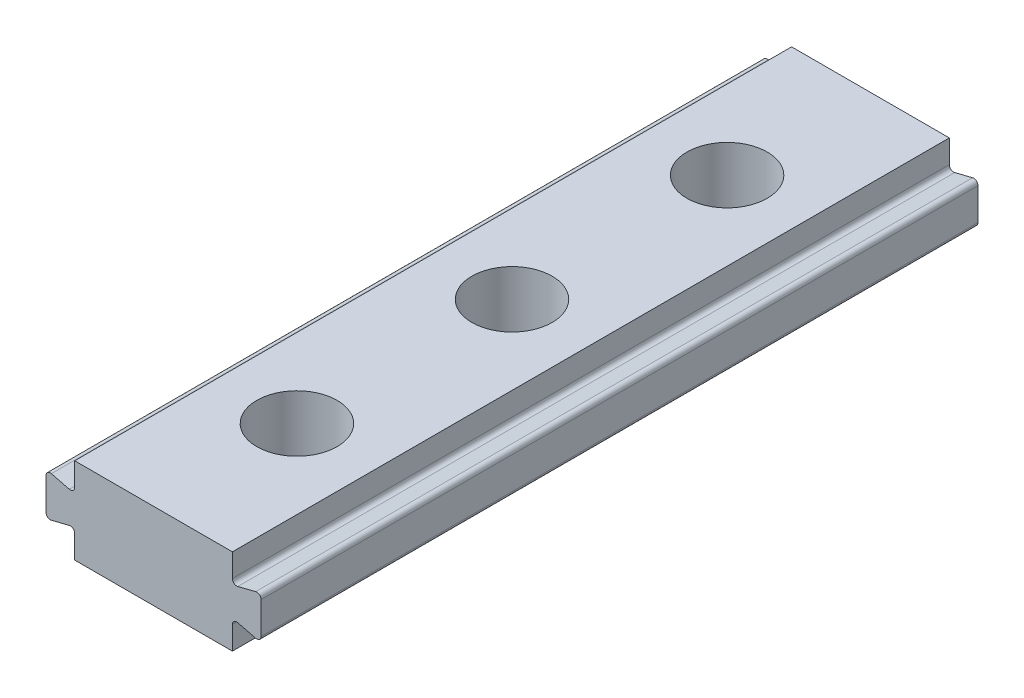
ISO-10303-21;
HEADER;
FILE_DESCRIPTION(('STEP AP214'),'2;1');
FILE_NAME('part.step','',(''),(''),'','','');
FILE_SCHEMA(('AUTOMOTIVE_DESIGN { 1 0 10303 214 1 1 1 1 }'));
ENDSEC;
DATA;
#1=APPLICATION_CONTEXT('core data for automotive mechanical design processes');
#2=APPLICATION_PROTOCOL_DEFINITION('international standard','automotive_design',2000,#1);
#3=PRODUCT_CONTEXT('',#1,'mechanical');
#4=PRODUCT('Part','Part','',(#3));
#5=PRODUCT_RELATED_PRODUCT_CATEGORY('part','',(#4));
#6=PRODUCT_DEFINITION_FORMATION('','',#4);
#7=PRODUCT_DEFINITION_CONTEXT('part definition',#1,'design');
#8=PRODUCT_DEFINITION('design','',#6,#7);
#9=PRODUCT_DEFINITION_SHAPE('','',#8);
#10=(LENGTH_UNIT() NAMED_UNIT(*) SI_UNIT(.MILLI.,.METRE.));
#11=(NAMED_UNIT(*) PLANE_ANGLE_UNIT() SI_UNIT($,.RADIAN.));
#12=(NAMED_UNIT(*) SI_UNIT($,.STERADIAN.) SOLID_ANGLE_UNIT());
#13=UNCERTAINTY_MEASURE_WITH_UNIT(LENGTH_MEASURE(1.E-05),#10,'distance_accuracy_value','');
#14=(GEOMETRIC_REPRESENTATION_CONTEXT(3) GLOBAL_UNCERTAINTY_ASSIGNED_CONTEXT((#13)) GLOBAL_UNIT_ASSIGNED_CONTEXT((#10,
#11,#12)) REPRESENTATION_CONTEXT('',''));
#15=CARTESIAN_POINT('',(0.,0.,0.));
#16=DIRECTION('',(0.,0.,1.));
#17=DIRECTION('',(1.,0.,0.));
#18=AXIS2_PLACEMENT_3D('',#15,#16,#17);
#19=CARTESIAN_POINT('',(-7.5,-3.,25.));
#20=DIRECTION('',(-1.,0.,0.));
#21=DIRECTION('',(0.,0.,1.));
#22=AXIS2_PLACEMENT_3D('',#19,#20,#21);
#23=PLANE('',#22);
#24=DIRECTION('',(0.,0.,1.));
#25=VECTOR('',#24,1.);
#26=CARTESIAN_POINT('',(-7.5,-1.11576707807868,-25.));
#27=LINE('',#26,#25);
#28=CARTESIAN_POINT('',(-7.5,-1.11576707807868,25.));
#29=VERTEX_POINT('',#28);
#30=CARTESIAN_POINT('',(-7.5,-1.11576707807868,-25.));
#31=VERTEX_POINT('',#30);
#32=EDGE_CURVE('E206',#29,#31,#27,.F.);
#33=ORIENTED_EDGE('',*,*,#32,.F.);
#34=DIRECTION('',(0.,1.,0.));
#35=VECTOR('',#34,1.);
#36=CARTESIAN_POINT('',(-7.5,-3.,25.));
#37=LINE('',#36,#35);
#38=CARTESIAN_POINT('',(-7.5,1.11576707807868,25.));
#39=VERTEX_POINT('',#38);
#40=EDGE_CURVE('E306',#29,#39,#37,.T.);
#41=ORIENTED_EDGE('',*,*,#40,.T.);
#42=DIRECTION('',(0.,0.,1.));
#43=VECTOR('',#42,1.);
#44=CARTESIAN_POINT('',(-7.5,1.11576707807868,-25.));
#45=LINE('',#44,#43);
#46=CARTESIAN_POINT('',(-7.5,1.11576707807868,-25.));
#47=VERTEX_POINT('',#46);
#48=EDGE_CURVE('E238',#39,#47,#45,.F.);
#49=ORIENTED_EDGE('',*,*,#48,.T.);
#50=DIRECTION('',(0.,1.,0.));
#51=VECTOR('',#50,1.);
#52=CARTESIAN_POINT('',(-7.5,-3.,-25.));
#53=LINE('',#52,#51);
#54=EDGE_CURVE('E309',#31,#47,#53,.T.);
#55=ORIENTED_EDGE('',*,*,#54,.F.);
#56=EDGE_LOOP('',(#33,#41,#49,#55));
#57=FACE_BOUND('',#56,.T.);
#58=ADVANCED_FACE('F34',(#57),#23,.T.);
#59=CARTESIAN_POINT('',(7.5,-3.,25.));
#60=DIRECTION('',(1.,0.,0.));
#61=DIRECTION('',(0.,0.,-1.));
#62=AXIS2_PLACEMENT_3D('',#59,#60,#61);
#63=PLANE('',#62);
#64=DIRECTION('',(0.,1.,0.));
#65=VECTOR('',#64,1.);
#66=CARTESIAN_POINT('',(7.5,-3.,-25.));
#67=LINE('',#66,#65);
#68=CARTESIAN_POINT('',(7.5,-1.11576707807868,-25.));
#69=VERTEX_POINT('',#68);
#70=CARTESIAN_POINT('',(7.5,1.11576707807868,-25.));
#71=VERTEX_POINT('',#70);
#72=EDGE_CURVE('E301',#69,#71,#67,.T.);
#73=ORIENTED_EDGE('',*,*,#72,.T.);
#74=DIRECTION('',(0.,0.,1.));
#75=VECTOR('',#74,1.);
#76=CARTESIAN_POINT('',(7.5,1.11576707807868,25.));
#77=LINE('',#76,#75);
#78=CARTESIAN_POINT('',(7.5,1.11576707807868,25.));
#79=VERTEX_POINT('',#78);
#80=EDGE_CURVE('E331',#71,#79,#77,.T.);
#81=ORIENTED_EDGE('',*,*,#80,.T.);
#82=DIRECTION('',(0.,1.,0.));
#83=VECTOR('',#82,1.);
#84=CARTESIAN_POINT('',(7.5,-3.,25.));
#85=LINE('',#84,#83);
#86=CARTESIAN_POINT('',(7.5,-1.11576707807868,25.));
#87=VERTEX_POINT('',#86);
#88=EDGE_CURVE('E302',#87,#79,#85,.T.);
#89=ORIENTED_EDGE('',*,*,#88,.F.);
#90=DIRECTION('',(0.,0.,1.));
#91=VECTOR('',#90,1.);
#92=CARTESIAN_POINT('',(7.5,-1.11576707807868,-25.));
#93=LINE('',#92,#91);
#94=EDGE_CURVE('E320',#87,#69,#93,.F.);
#95=ORIENTED_EDGE('',*,*,#94,.T.);
#96=EDGE_LOOP('',(#73,#81,#89,#95));
#97=FACE_BOUND('',#96,.T.);
#98=ADVANCED_FACE('F369',(#97),#63,.T.);
#99=CARTESIAN_POINT('',(-7.5,-3.,25.));
#100=DIRECTION('',(0.,0.,1.));
#101=DIRECTION('',(1.,0.,0.));
#102=AXIS2_PLACEMENT_3D('',#99,#100,#101);
#103=PLANE('',#102);
#104=DIRECTION('',(0.,-1.,0.));
#105=VECTOR('',#104,1.);
#106=CARTESIAN_POINT('',(-5.5,-3.,25.));
#107=LINE('',#106,#105);
#108=CARTESIAN_POINT('',(-5.5,-1.38423292192132,25.));
#109=VERTEX_POINT('',#108);
#110=CARTESIAN_POINT('',(-5.5,-3.,25.));
#111=VERTEX_POINT('',#110);
#112=EDGE_CURVE('E211',#109,#111,#107,.T.);
#113=ORIENTED_EDGE('',*,*,#112,.T.);
#114=DIRECTION('',(1.,0.,0.));
#115=VECTOR('',#114,1.);
#116=CARTESIAN_POINT('',(-7.5,-3.,25.));
#117=LINE('',#116,#115);
#118=CARTESIAN_POINT('',(5.5,-3.,25.));
#119=VERTEX_POINT('',#118);
#120=EDGE_CURVE('E299',#111,#119,#117,.T.);
#121=ORIENTED_EDGE('',*,*,#120,.T.);
#122=DIRECTION('',(0.,-1.,0.));
#123=VECTOR('',#122,1.);
#124=CARTESIAN_POINT('',(5.5,-3.,25.));
#125=LINE('',#124,#123);
#126=CARTESIAN_POINT('',(5.5,-1.38423292192132,25.));
#127=VERTEX_POINT('',#126);
#128=EDGE_CURVE('E263',#127,#119,#125,.T.);
#129=ORIENTED_EDGE('',*,*,#128,.F.);
#130=CARTESIAN_POINT('',(5.8,-1.38423292192132,25.));
#131=DIRECTION('',(0.,0.,1.));
#132=DIRECTION('',(1.,0.,0.));
#133=AXIS2_PLACEMENT_3D('',#130,#131,#132);
#134=CIRCLE('',#133,0.3);
#135=CARTESIAN_POINT('',(5.8727606875109,-1.09319017187772,25.));
#136=VERTEX_POINT('',#135);
#137=EDGE_CURVE('E327',#127,#136,#134,.F.);
#138=ORIENTED_EDGE('',*,*,#137,.T.);
#139=DIRECTION('',(-0.970142500145332,0.242535625036333,0.));
#140=VECTOR('',#139,1.);
#141=CARTESIAN_POINT('',(5.5,-1.,25.));
#142=LINE('',#141,#140);
#143=CARTESIAN_POINT('',(7.1272393124891,-1.40680982812228,25.));
#144=VERTEX_POINT('',#143);
#145=EDGE_CURVE('E260',#144,#136,#142,.T.);
#146=ORIENTED_EDGE('',*,*,#145,.F.);
#147=CARTESIAN_POINT('',(7.2,-1.11576707807868,25.));
#148=DIRECTION('',(0.,0.,1.));
#149=DIRECTION('',(1.,0.,0.));
#150=AXIS2_PLACEMENT_3D('',#147,#148,#149);
#151=CIRCLE('',#150,0.3);
#152=EDGE_CURVE('E318',#144,#87,#151,.T.);
#153=ORIENTED_EDGE('',*,*,#152,.T.);
#154=ORIENTED_EDGE('',*,*,#88,.T.);
#155=CARTESIAN_POINT('',(7.2,1.11576707807868,25.));
#156=DIRECTION('',(0.,0.,1.));
#157=DIRECTION('',(1.,0.,0.));
#158=AXIS2_PLACEMENT_3D('',#155,#156,#157);
#159=CIRCLE('',#158,0.3);
#160=CARTESIAN_POINT('',(7.1272393124891,1.40680982812228,25.));
#161=VERTEX_POINT('',#160);
#162=EDGE_CURVE('E334',#79,#161,#159,.T.);
#163=ORIENTED_EDGE('',*,*,#162,.T.);
#164=DIRECTION('',(-0.970142500145332,-0.242535625036333,0.));
#165=VECTOR('',#164,1.);
#166=CARTESIAN_POINT('',(5.5,1.,25.));
#167=LINE('',#166,#165);
#168=CARTESIAN_POINT('',(5.8727606875109,1.09319017187772,25.));
#169=VERTEX_POINT('',#168);
#170=EDGE_CURVE('E249',#161,#169,#167,.T.);
#171=ORIENTED_EDGE('',*,*,#170,.T.);
#172=CARTESIAN_POINT('',(5.8,1.38423292192132,25.));
#173=DIRECTION('',(0.,0.,1.));
#174=DIRECTION('',(1.,0.,0.));
#175=AXIS2_PLACEMENT_3D('',#172,#173,#174);
#176=CIRCLE('',#175,0.3);
#177=CARTESIAN_POINT('',(5.5,1.38423292192132,25.));
#178=VERTEX_POINT('',#177);
#179=EDGE_CURVE('E42',#169,#178,#176,.F.);
#180=ORIENTED_EDGE('',*,*,#179,.T.);
#181=DIRECTION('',(0.,1.,0.));
#182=VECTOR('',#181,1.);
#183=CARTESIAN_POINT('',(5.5,3.,25.));
#184=LINE('',#183,#182);
#185=CARTESIAN_POINT('',(5.5,3.,25.));
#186=VERTEX_POINT('',#185);
#187=EDGE_CURVE('E216',#178,#186,#184,.T.);
#188=ORIENTED_EDGE('',*,*,#187,.T.);
#189=DIRECTION('',(1.,0.,0.));
#190=VECTOR('',#189,1.);
#191=CARTESIAN_POINT('',(-7.5,3.,25.));
#192=LINE('',#191,#190);
#193=CARTESIAN_POINT('',(-5.5,3.,25.));
#194=VERTEX_POINT('',#193);
#195=EDGE_CURVE('E295',#194,#186,#192,.T.);
#196=ORIENTED_EDGE('',*,*,#195,.F.);
#197=DIRECTION('',(0.,1.,0.));
#198=VECTOR('',#197,1.);
#199=CARTESIAN_POINT('',(-5.5,3.,25.));
#200=LINE('',#199,#198);
#201=CARTESIAN_POINT('',(-5.5,1.38423292192132,25.));
#202=VERTEX_POINT('',#201);
#203=EDGE_CURVE('E196',#202,#194,#200,.T.);
#204=ORIENTED_EDGE('',*,*,#203,.F.);
#205=CARTESIAN_POINT('',(-5.8,1.38423292192132,25.));
#206=DIRECTION('',(0.,0.,1.));
#207=DIRECTION('',(-1.,0.,0.));
#208=AXIS2_PLACEMENT_3D('',#205,#206,#207);
#209=CIRCLE('',#208,0.3);
#210=CARTESIAN_POINT('',(-5.8727606875109,1.09319017187772,25.));
#211=VERTEX_POINT('',#210);
#212=EDGE_CURVE('E223',#202,#211,#209,.F.);
#213=ORIENTED_EDGE('',*,*,#212,.T.);
#214=DIRECTION('',(0.970142500145332,-0.242535625036333,0.));
#215=VECTOR('',#214,1.);
#216=CARTESIAN_POINT('',(-5.5,1.,25.));
#217=LINE('',#216,#215);
#218=CARTESIAN_POINT('',(-7.1272393124891,1.40680982812228,25.));
#219=VERTEX_POINT('',#218);
#220=EDGE_CURVE('E234',#219,#211,#217,.T.);
#221=ORIENTED_EDGE('',*,*,#220,.F.);
#222=CARTESIAN_POINT('',(-7.2,1.11576707807868,25.));
#223=DIRECTION('',(0.,0.,1.));
#224=DIRECTION('',(-1.,0.,0.));
#225=AXIS2_PLACEMENT_3D('',#222,#223,#224);
#226=CIRCLE('',#225,0.3);
#227=EDGE_CURVE('E240',#219,#39,#226,.T.);
#228=ORIENTED_EDGE('',*,*,#227,.T.);
#229=ORIENTED_EDGE('',*,*,#40,.F.);
#230=CARTESIAN_POINT('',(-7.2,-1.11576707807868,25.));
#231=DIRECTION('',(0.,0.,-1.));
#232=DIRECTION('',(-1.,0.,0.));
#233=AXIS2_PLACEMENT_3D('',#230,#231,#232);
#234=CIRCLE('',#233,0.3);
#235=CARTESIAN_POINT('',(-7.1272393124891,-1.40680982812228,25.));
#236=VERTEX_POINT('',#235);
#237=EDGE_CURVE('E208',#236,#29,#234,.T.);
#238=ORIENTED_EDGE('',*,*,#237,.F.);
#239=DIRECTION('',(0.970142500145332,0.242535625036333,0.));
#240=VECTOR('',#239,1.);
#241=CARTESIAN_POINT('',(-5.5,-1.,25.));
#242=LINE('',#241,#240);
#243=CARTESIAN_POINT('',(-5.8727606875109,-1.09319017187772,25.));
#244=VERTEX_POINT('',#243);
#245=EDGE_CURVE('E202',#236,#244,#242,.T.);
#246=ORIENTED_EDGE('',*,*,#245,.T.);
#247=CARTESIAN_POINT('',(-5.8,-1.38423292192132,25.));
#248=DIRECTION('',(0.,0.,-1.));
#249=DIRECTION('',(-1.,0.,0.));
#250=AXIS2_PLACEMENT_3D('',#247,#248,#249);
#251=CIRCLE('',#250,0.3);
#252=EDGE_CURVE('E177',#109,#244,#251,.F.);
#253=ORIENTED_EDGE('',*,*,#252,.F.);
#254=EDGE_LOOP('',(#113,#121,#129,#138,#146,#153,#154,#163,#171,#180,#188,#196,#204,#213,#221,
#228,#229,#238,#246,#253));
#255=FACE_BOUND('',#254,.T.);
#256=ADVANCED_FACE('F346',(#255),#103,.T.);
#257=CARTESIAN_POINT('',(-7.5,-3.,-25.));
#258=DIRECTION('',(0.,0.,-1.));
#259=DIRECTION('',(-1.,0.,0.));
#260=AXIS2_PLACEMENT_3D('',#257,#258,#259);
#261=PLANE('',#260);
#262=DIRECTION('',(0.,-1.,0.));
#263=VECTOR('',#262,1.);
#264=CARTESIAN_POINT('',(-5.5,-3.,-25.));
#265=LINE('',#264,#263);
#266=CARTESIAN_POINT('',(-5.5,-1.38423292192132,-25.));
#267=VERTEX_POINT('',#266);
#268=CARTESIAN_POINT('',(-5.5,-3.,-25.));
#269=VERTEX_POINT('',#268);
#270=EDGE_CURVE('E57',#267,#269,#265,.T.);
#271=ORIENTED_EDGE('',*,*,#270,.F.);
#272=CARTESIAN_POINT('',(-5.8,-1.38423292192132,-25.));
#273=DIRECTION('',(0.,0.,1.));
#274=DIRECTION('',(1.,0.,0.));
#275=AXIS2_PLACEMENT_3D('',#272,#273,#274);
#276=CIRCLE('',#275,0.3);
#277=CARTESIAN_POINT('',(-5.8727606875109,-1.09319017187772,-25.));
#278=VERTEX_POINT('',#277);
#279=EDGE_CURVE('E175',#278,#267,#276,.F.);
#280=ORIENTED_EDGE('',*,*,#279,.F.);
#281=DIRECTION('',(0.970142500145332,0.242535625036333,0.));
#282=VECTOR('',#281,1.);
#283=CARTESIAN_POINT('',(-5.5,-1.,-25.));
#284=LINE('',#283,#282);
#285=CARTESIAN_POINT('',(-7.1272393124891,-1.40680982812228,-25.));
#286=VERTEX_POINT('',#285);
#287=EDGE_CURVE('E183',#286,#278,#284,.T.);
#288=ORIENTED_EDGE('',*,*,#287,.F.);
#289=CARTESIAN_POINT('',(-7.2,-1.11576707807868,-25.));
#290=DIRECTION('',(0.,0.,1.));
#291=DIRECTION('',(1.,0.,0.));
#292=AXIS2_PLACEMENT_3D('',#289,#290,#291);
#293=CIRCLE('',#292,0.3);
#294=EDGE_CURVE('E204',#31,#286,#293,.T.);
#295=ORIENTED_EDGE('',*,*,#294,.F.);
#296=ORIENTED_EDGE('',*,*,#54,.T.);
#297=CARTESIAN_POINT('',(-7.2,1.11576707807868,-25.));
#298=DIRECTION('',(0.,0.,-1.));
#299=DIRECTION('',(1.,0.,0.));
#300=AXIS2_PLACEMENT_3D('',#297,#298,#299);
#301=CIRCLE('',#300,0.3);
#302=CARTESIAN_POINT('',(-7.1272393124891,1.40680982812228,-25.));
#303=VERTEX_POINT('',#302);
#304=EDGE_CURVE('E49',#47,#303,#301,.T.);
#305=ORIENTED_EDGE('',*,*,#304,.T.);
#306=DIRECTION('',(0.970142500145332,-0.242535625036333,0.));
#307=VECTOR('',#306,1.);
#308=CARTESIAN_POINT('',(-5.5,1.,-25.));
#309=LINE('',#308,#307);
#310=CARTESIAN_POINT('',(-5.8727606875109,1.09319017187772,-25.));
#311=VERTEX_POINT('',#310);
#312=EDGE_CURVE('E229',#303,#311,#309,.T.);
#313=ORIENTED_EDGE('',*,*,#312,.T.);
#314=CARTESIAN_POINT('',(-5.8,1.38423292192132,-25.));
#315=DIRECTION('',(0.,0.,-1.));
#316=DIRECTION('',(1.,0.,0.));
#317=AXIS2_PLACEMENT_3D('',#314,#315,#316);
#318=CIRCLE('',#317,0.3);
#319=CARTESIAN_POINT('',(-5.5,1.38423292192132,-25.));
#320=VERTEX_POINT('',#319);
#321=EDGE_CURVE('E217',#311,#320,#318,.F.);
#322=ORIENTED_EDGE('',*,*,#321,.T.);
#323=DIRECTION('',(0.,1.,0.));
#324=VECTOR('',#323,1.);
#325=CARTESIAN_POINT('',(-5.5,3.,-25.));
#326=LINE('',#325,#324);
#327=CARTESIAN_POINT('',(-5.5,3.,-25.));
#328=VERTEX_POINT('',#327);
#329=EDGE_CURVE('E243',#320,#328,#326,.T.);
#330=ORIENTED_EDGE('',*,*,#329,.T.);
#331=DIRECTION('',(-1.,0.,0.));
#332=VECTOR('',#331,1.);
#333=CARTESIAN_POINT('',(-7.5,3.,-25.));
#334=LINE('',#333,#332);
#335=CARTESIAN_POINT('',(5.5,3.,-25.));
#336=VERTEX_POINT('',#335);
#337=EDGE_CURVE('E292',#336,#328,#334,.T.);
#338=ORIENTED_EDGE('',*,*,#337,.F.);
#339=DIRECTION('',(0.,1.,0.));
#340=VECTOR('',#339,1.);
#341=CARTESIAN_POINT('',(5.5,3.,-25.));
#342=LINE('',#341,#340);
#343=CARTESIAN_POINT('',(5.5,1.38423292192132,-25.));
#344=VERTEX_POINT('',#343);
#345=EDGE_CURVE('E252',#344,#336,#342,.T.);
#346=ORIENTED_EDGE('',*,*,#345,.F.);
#347=CARTESIAN_POINT('',(5.8,1.38423292192132,-25.));
#348=DIRECTION('',(0.,0.,-1.));
#349=DIRECTION('',(-1.,0.,0.));
#350=AXIS2_PLACEMENT_3D('',#347,#348,#349);
#351=CIRCLE('',#350,0.3);
#352=CARTESIAN_POINT('',(5.8727606875109,1.09319017187772,-25.));
#353=VERTEX_POINT('',#352);
#354=EDGE_CURVE('E11',#344,#353,#351,.F.);
#355=ORIENTED_EDGE('',*,*,#354,.T.);
#356=DIRECTION('',(-0.970142500145332,-0.242535625036333,0.));
#357=VECTOR('',#356,1.);
#358=CARTESIAN_POINT('',(5.5,1.,-25.));
#359=LINE('',#358,#357);
#360=CARTESIAN_POINT('',(7.1272393124891,1.40680982812228,-25.));
#361=VERTEX_POINT('',#360);
#362=EDGE_CURVE('E254',#361,#353,#359,.T.);
#363=ORIENTED_EDGE('',*,*,#362,.F.);
#364=CARTESIAN_POINT('',(7.2,1.11576707807868,-25.));
#365=DIRECTION('',(0.,0.,-1.));
#366=DIRECTION('',(-1.,0.,0.));
#367=AXIS2_PLACEMENT_3D('',#364,#365,#366);
#368=CIRCLE('',#367,0.3);
#369=EDGE_CURVE('E341',#361,#71,#368,.T.);
#370=ORIENTED_EDGE('',*,*,#369,.T.);
#371=ORIENTED_EDGE('',*,*,#72,.F.);
#372=CARTESIAN_POINT('',(7.2,-1.11576707807868,-25.));
#373=DIRECTION('',(0.,0.,-1.));
#374=DIRECTION('',(-1.,0.,0.));
#375=AXIS2_PLACEMENT_3D('',#372,#373,#374);
#376=CIRCLE('',#375,0.3);
#377=CARTESIAN_POINT('',(7.1272393124891,-1.40680982812228,-25.));
#378=VERTEX_POINT('',#377);
#379=EDGE_CURVE('E322',#69,#378,#376,.T.);
#380=ORIENTED_EDGE('',*,*,#379,.T.);
#381=DIRECTION('',(-0.970142500145332,0.242535625036333,0.));
#382=VECTOR('',#381,1.);
#383=CARTESIAN_POINT('',(5.5,-1.,-25.));
#384=LINE('',#383,#382);
#385=CARTESIAN_POINT('',(5.8727606875109,-1.09319017187772,-25.));
#386=VERTEX_POINT('',#385);
#387=EDGE_CURVE('E266',#378,#386,#384,.T.);
#388=ORIENTED_EDGE('',*,*,#387,.T.);
#389=CARTESIAN_POINT('',(5.8,-1.38423292192132,-25.));
#390=DIRECTION('',(0.,0.,-1.));
#391=DIRECTION('',(-1.,0.,0.));
#392=AXIS2_PLACEMENT_3D('',#389,#390,#391);
#393=CIRCLE('',#392,0.3);
#394=CARTESIAN_POINT('',(5.5,-1.38423292192132,-25.));
#395=VERTEX_POINT('',#394);
#396=EDGE_CURVE('E329',#386,#395,#393,.F.);
#397=ORIENTED_EDGE('',*,*,#396,.T.);
#398=DIRECTION('',(0.,-1.,0.));
#399=VECTOR('',#398,1.);
#400=CARTESIAN_POINT('',(5.5,-3.,-25.));
#401=LINE('',#400,#399);
#402=CARTESIAN_POINT('',(5.5,-3.,-25.));
#403=VERTEX_POINT('',#402);
#404=EDGE_CURVE('E269',#395,#403,#401,.T.);
#405=ORIENTED_EDGE('',*,*,#404,.T.);
#406=DIRECTION('',(-1.,0.,0.));
#407=VECTOR('',#406,1.);
#408=CARTESIAN_POINT('',(-7.5,-3.,-25.));
#409=LINE('',#408,#407);
#410=EDGE_CURVE('E297',#403,#269,#409,.T.);
#411=ORIENTED_EDGE('',*,*,#410,.T.);
#412=EDGE_LOOP('',(#271,#280,#288,#295,#296,#305,#313,#322,#330,#338,#346,#355,#363,#370,#371,
#380,#388,#397,#405,#411));
#413=FACE_BOUND('',#412,.T.);
#414=ADVANCED_FACE('F191',(#413),#261,.T.);
#415=CARTESIAN_POINT('',(0.,3.,0.));
#416=DIRECTION('',(0.,-1.,0.));
#417=DIRECTION('',(0.,0.,-1.));
#418=AXIS2_PLACEMENT_3D('',#415,#416,#417);
#419=PLANE('',#418);
#420=CARTESIAN_POINT('',(0.,3.,0.));
#421=DIRECTION('',(0.,1.,0.));
#422=DIRECTION('',(0.,0.,1.));
#423=AXIS2_PLACEMENT_3D('',#420,#421,#422);
#424=CIRCLE('',#423,2.80000000000001);
#425=CARTESIAN_POINT('',(0.,3.,2.80000000000001));
#426=VERTEX_POINT('',#425);
#427=EDGE_CURVE('E286',#426,#426,#424,.T.);
#428=ORIENTED_EDGE('',*,*,#427,.F.);
#429=EDGE_LOOP('',(#428));
#430=FACE_BOUND('',#429,.T.);
#431=CARTESIAN_POINT('',(0.,3.,15.));
#432=DIRECTION('',(0.,1.,0.));
#433=DIRECTION('',(0.,0.,1.));
#434=AXIS2_PLACEMENT_3D('',#431,#432,#433);
#435=CIRCLE('',#434,2.80000000000001);
#436=CARTESIAN_POINT('',(0.,3.,17.8));
#437=VERTEX_POINT('',#436);
#438=EDGE_CURVE('E280',#437,#437,#435,.T.);
#439=ORIENTED_EDGE('',*,*,#438,.F.);
#440=EDGE_LOOP('',(#439));
#441=FACE_BOUND('',#440,.T.);
#442=CARTESIAN_POINT('',(0.,3.,-15.));
#443=DIRECTION('',(0.,1.,0.));
#444=DIRECTION('',(0.,0.,1.));
#445=AXIS2_PLACEMENT_3D('',#442,#443,#444);
#446=CIRCLE('',#445,2.80000000000001);
#447=CARTESIAN_POINT('',(0.,3.,-12.2));
#448=VERTEX_POINT('',#447);
#449=EDGE_CURVE('E274',#448,#448,#446,.T.);
#450=ORIENTED_EDGE('',*,*,#449,.F.);
#451=EDGE_LOOP('',(#450));
#452=FACE_BOUND('',#451,.T.);
#453=ORIENTED_EDGE('',*,*,#337,.T.);
#454=DIRECTION('',(0.,0.,1.));
#455=VECTOR('',#454,1.);
#456=CARTESIAN_POINT('',(-5.5,3.,-25.));
#457=LINE('',#456,#455);
#458=EDGE_CURVE('E193',#328,#194,#457,.T.);
#459=ORIENTED_EDGE('',*,*,#458,.T.);
#460=ORIENTED_EDGE('',*,*,#195,.T.);
#461=DIRECTION('',(0.,0.,1.));
#462=VECTOR('',#461,1.);
#463=CARTESIAN_POINT('',(5.5,3.,-25.));
#464=LINE('',#463,#462);
#465=EDGE_CURVE('E257',#336,#186,#464,.T.);
#466=ORIENTED_EDGE('',*,*,#465,.F.);
#467=EDGE_LOOP('',(#453,#459,#460,#466));
#468=FACE_BOUND('',#467,.T.);
#469=ADVANCED_FACE('F415',(#430,#441,#452,#468),#419,.F.);
#470=CARTESIAN_POINT('',(0.,-3.,0.));
#471=DIRECTION('',(0.,-1.,0.));
#472=DIRECTION('',(0.,0.,-1.));
#473=AXIS2_PLACEMENT_3D('',#470,#471,#472);
#474=PLANE('',#473);
#475=DIRECTION('',(0.,0.,1.));
#476=VECTOR('',#475,1.);
#477=CARTESIAN_POINT('',(-5.5,-3.,-25.));
#478=LINE('',#477,#476);
#479=EDGE_CURVE('E214',#269,#111,#478,.T.);
#480=ORIENTED_EDGE('',*,*,#479,.F.);
#481=ORIENTED_EDGE('',*,*,#410,.F.);
#482=DIRECTION('',(0.,0.,1.));
#483=VECTOR('',#482,1.);
#484=CARTESIAN_POINT('',(5.5,-3.,-25.));
#485=LINE('',#484,#483);
#486=EDGE_CURVE('E271',#403,#119,#485,.T.);
#487=ORIENTED_EDGE('',*,*,#486,.T.);
#488=ORIENTED_EDGE('',*,*,#120,.F.);
#489=EDGE_LOOP('',(#480,#481,#487,#488));
#490=FACE_BOUND('',#489,.T.);
#491=CARTESIAN_POINT('',(0.,-3.,-15.));
#492=DIRECTION('',(0.,1.,0.));
#493=DIRECTION('',(0.,0.,1.));
#494=AXIS2_PLACEMENT_3D('',#491,#492,#493);
#495=CIRCLE('',#494,2.80000000000001);
#496=CARTESIAN_POINT('',(0.,-3.,-12.2));
#497=VERTEX_POINT('',#496);
#498=EDGE_CURVE('E277',#497,#497,#495,.T.);
#499=ORIENTED_EDGE('',*,*,#498,.T.);
#500=EDGE_LOOP('',(#499));
#501=FACE_BOUND('',#500,.T.);
#502=CARTESIAN_POINT('',(0.,-3.,15.));
#503=DIRECTION('',(0.,1.,0.));
#504=DIRECTION('',(0.,0.,1.));
#505=AXIS2_PLACEMENT_3D('',#502,#503,#504);
#506=CIRCLE('',#505,2.80000000000001);
#507=CARTESIAN_POINT('',(0.,-3.,17.8));
#508=VERTEX_POINT('',#507);
#509=EDGE_CURVE('E283',#508,#508,#506,.T.);
#510=ORIENTED_EDGE('',*,*,#509,.T.);
#511=EDGE_LOOP('',(#510));
#512=FACE_BOUND('',#511,.T.);
#513=CARTESIAN_POINT('',(0.,-3.,0.));
#514=DIRECTION('',(0.,1.,0.));
#515=DIRECTION('',(0.,0.,1.));
#516=AXIS2_PLACEMENT_3D('',#513,#514,#515);
#517=CIRCLE('',#516,2.80000000000001);
#518=CARTESIAN_POINT('',(0.,-3.,2.80000000000001));
#519=VERTEX_POINT('',#518);
#520=EDGE_CURVE('E289',#519,#519,#517,.T.);
#521=ORIENTED_EDGE('',*,*,#520,.T.);
#522=EDGE_LOOP('',(#521));
#523=FACE_BOUND('',#522,.T.);
#524=ADVANCED_FACE('F392',(#490,#501,#512,#523),#474,.T.);
#525=CARTESIAN_POINT('',(0.,3.,0.));
#526=DIRECTION('',(0.,1.,0.));
#527=DIRECTION('',(0.,0.,1.));
#528=AXIS2_PLACEMENT_3D('',#525,#526,#527);
#529=CYLINDRICAL_SURFACE('',#528,2.80000000000001);
#530=ORIENTED_EDGE('',*,*,#520,.F.);
#531=EDGE_LOOP('',(#530));
#532=FACE_BOUND('',#531,.T.);
#533=ORIENTED_EDGE('',*,*,#427,.T.);
#534=EDGE_LOOP('',(#533));
#535=FACE_BOUND('',#534,.T.);
#536=ADVANCED_FACE('F423',(#532,#535),#529,.F.);
#537=CARTESIAN_POINT('',(0.,3.,15.));
#538=DIRECTION('',(0.,1.,0.));
#539=DIRECTION('',(0.,0.,1.));
#540=AXIS2_PLACEMENT_3D('',#537,#538,#539);
#541=CYLINDRICAL_SURFACE('',#540,2.80000000000001);
#542=ORIENTED_EDGE('',*,*,#509,.F.);
#543=EDGE_LOOP('',(#542));
#544=FACE_BOUND('',#543,.T.);
#545=ORIENTED_EDGE('',*,*,#438,.T.);
#546=EDGE_LOOP('',(#545));
#547=FACE_BOUND('',#546,.T.);
#548=ADVANCED_FACE('F459',(#544,#547),#541,.F.);
#549=CARTESIAN_POINT('',(0.,3.,-15.));
#550=DIRECTION('',(0.,1.,0.));
#551=DIRECTION('',(0.,0.,1.));
#552=AXIS2_PLACEMENT_3D('',#549,#550,#551);
#553=CYLINDRICAL_SURFACE('',#552,2.80000000000001);
#554=ORIENTED_EDGE('',*,*,#498,.F.);
#555=EDGE_LOOP('',(#554));
#556=FACE_BOUND('',#555,.T.);
#557=ORIENTED_EDGE('',*,*,#449,.T.);
#558=EDGE_LOOP('',(#557));
#559=FACE_BOUND('',#558,.T.);
#560=ADVANCED_FACE('F454',(#556,#559),#553,.F.);
#561=CARTESIAN_POINT('',(5.5,-3.,-25.));
#562=DIRECTION('',(-1.,0.,0.));
#563=DIRECTION('',(0.,0.,1.));
#564=AXIS2_PLACEMENT_3D('',#561,#562,#563);
#565=PLANE('',#564);
#566=ORIENTED_EDGE('',*,*,#404,.F.);
#567=DIRECTION('',(0.,0.,1.));
#568=VECTOR('',#567,1.);
#569=CARTESIAN_POINT('',(5.5,-1.38423292192132,25.));
#570=LINE('',#569,#568);
#571=EDGE_CURVE('E324',#395,#127,#570,.T.);
#572=ORIENTED_EDGE('',*,*,#571,.T.);
#573=ORIENTED_EDGE('',*,*,#128,.T.);
#574=ORIENTED_EDGE('',*,*,#486,.F.);
#575=EDGE_LOOP('',(#566,#572,#573,#574));
#576=FACE_BOUND('',#575,.T.);
#577=ADVANCED_FACE('F387',(#576),#565,.F.);
#578=CARTESIAN_POINT('',(5.5,-1.,-25.));
#579=DIRECTION('',(0.242535625036333,0.970142500145332,0.));
#580=DIRECTION('',(-0.970142500145332,0.242535625036333,0.));
#581=AXIS2_PLACEMENT_3D('',#578,#579,#580);
#582=PLANE('',#581);
#583=ORIENTED_EDGE('',*,*,#387,.F.);
#584=DIRECTION('',(0.,0.,1.));
#585=VECTOR('',#584,1.);
#586=CARTESIAN_POINT('',(7.1272393124891,-1.40680982812228,25.));
#587=LINE('',#586,#585);
#588=EDGE_CURVE('E315',#378,#144,#587,.T.);
#589=ORIENTED_EDGE('',*,*,#588,.T.);
#590=ORIENTED_EDGE('',*,*,#145,.T.);
#591=DIRECTION('',(0.,0.,1.));
#592=VECTOR('',#591,1.);
#593=CARTESIAN_POINT('',(5.8727606875109,-1.09319017187772,-25.));
#594=LINE('',#593,#592);
#595=EDGE_CURVE('E305',#136,#386,#594,.F.);
#596=ORIENTED_EDGE('',*,*,#595,.T.);
#597=EDGE_LOOP('',(#583,#589,#590,#596));
#598=FACE_BOUND('',#597,.T.);
#599=ADVANCED_FACE('F378',(#598),#582,.F.);
#600=CARTESIAN_POINT('',(7.2,-1.11576707807868,-25.));
#601=DIRECTION('',(0.,0.,-1.));
#602=DIRECTION('',(-1.,0.,0.));
#603=AXIS2_PLACEMENT_3D('',#600,#601,#602);
#604=CYLINDRICAL_SURFACE('',#603,0.3);
#605=ORIENTED_EDGE('',*,*,#379,.F.);
#606=ORIENTED_EDGE('',*,*,#94,.F.);
#607=ORIENTED_EDGE('',*,*,#152,.F.);
#608=ORIENTED_EDGE('',*,*,#588,.F.);
#609=EDGE_LOOP('',(#605,#606,#607,#608));
#610=FACE_BOUND('',#609,.T.);
#611=ADVANCED_FACE('F373',(#610),#604,.T.);
#612=CARTESIAN_POINT('',(5.8,-1.38423292192132,-25.));
#613=DIRECTION('',(0.,0.,-1.));
#614=DIRECTION('',(-1.,0.,0.));
#615=AXIS2_PLACEMENT_3D('',#612,#613,#614);
#616=CYLINDRICAL_SURFACE('',#615,0.3);
#617=ORIENTED_EDGE('',*,*,#396,.F.);
#618=ORIENTED_EDGE('',*,*,#595,.F.);
#619=ORIENTED_EDGE('',*,*,#137,.F.);
#620=ORIENTED_EDGE('',*,*,#571,.F.);
#621=EDGE_LOOP('',(#617,#618,#619,#620));
#622=FACE_BOUND('',#621,.T.);
#623=ADVANCED_FACE('F382',(#622),#616,.F.);
#624=CARTESIAN_POINT('',(5.5,1.,-25.));
#625=DIRECTION('',(-0.242535625036333,0.970142500145332,0.));
#626=DIRECTION('',(-0.970142500145332,-0.242535625036333,0.));
#627=AXIS2_PLACEMENT_3D('',#624,#625,#626);
#628=PLANE('',#627);
#629=ORIENTED_EDGE('',*,*,#170,.F.);
#630=DIRECTION('',(0.,0.,1.));
#631=VECTOR('',#630,1.);
#632=CARTESIAN_POINT('',(7.1272393124891,1.40680982812228,-25.));
#633=LINE('',#632,#631);
#634=EDGE_CURVE('E339',#161,#361,#633,.F.);
#635=ORIENTED_EDGE('',*,*,#634,.T.);
#636=ORIENTED_EDGE('',*,*,#362,.T.);
#637=DIRECTION('',(0.,0.,1.));
#638=VECTOR('',#637,1.);
#639=CARTESIAN_POINT('',(5.8727606875109,1.09319017187772,25.));
#640=LINE('',#639,#638);
#641=EDGE_CURVE('E336',#353,#169,#640,.T.);
#642=ORIENTED_EDGE('',*,*,#641,.T.);
#643=EDGE_LOOP('',(#629,#635,#636,#642));
#644=FACE_BOUND('',#643,.T.);
#645=ADVANCED_FACE('F361',(#644),#628,.T.);
#646=CARTESIAN_POINT('',(5.5,3.,-25.));
#647=DIRECTION('',(1.,0.,0.));
#648=DIRECTION('',(0.,0.,-1.));
#649=AXIS2_PLACEMENT_3D('',#646,#647,#648);
#650=PLANE('',#649);
#651=ORIENTED_EDGE('',*,*,#187,.F.);
#652=DIRECTION('',(0.,0.,1.));
#653=VECTOR('',#652,1.);
#654=CARTESIAN_POINT('',(5.5,1.38423292192132,-25.));
#655=LINE('',#654,#653);
#656=EDGE_CURVE('E343',#178,#344,#655,.F.);
#657=ORIENTED_EDGE('',*,*,#656,.T.);
#658=ORIENTED_EDGE('',*,*,#345,.T.);
#659=ORIENTED_EDGE('',*,*,#465,.T.);
#660=EDGE_LOOP('',(#651,#657,#658,#659));
#661=FACE_BOUND('',#660,.T.);
#662=ADVANCED_FACE('F353',(#661),#650,.T.);
#663=CARTESIAN_POINT('',(7.2,1.11576707807868,25.));
#664=DIRECTION('',(0.,0.,1.));
#665=DIRECTION('',(1.,0.,0.));
#666=AXIS2_PLACEMENT_3D('',#663,#664,#665);
#667=CYLINDRICAL_SURFACE('',#666,0.3);
#668=ORIENTED_EDGE('',*,*,#369,.F.);
#669=ORIENTED_EDGE('',*,*,#634,.F.);
#670=ORIENTED_EDGE('',*,*,#162,.F.);
#671=ORIENTED_EDGE('',*,*,#80,.F.);
#672=EDGE_LOOP('',(#668,#669,#670,#671));
#673=FACE_BOUND('',#672,.T.);
#674=ADVANCED_FACE('F364',(#673),#667,.T.);
#675=CARTESIAN_POINT('',(5.8,1.38423292192132,-25.));
#676=DIRECTION('',(0.,0.,-1.));
#677=DIRECTION('',(-1.,0.,0.));
#678=AXIS2_PLACEMENT_3D('',#675,#676,#677);
#679=CYLINDRICAL_SURFACE('',#678,0.3);
#680=ORIENTED_EDGE('',*,*,#354,.F.);
#681=ORIENTED_EDGE('',*,*,#656,.F.);
#682=ORIENTED_EDGE('',*,*,#179,.F.);
#683=ORIENTED_EDGE('',*,*,#641,.F.);
#684=EDGE_LOOP('',(#680,#681,#682,#683));
#685=FACE_BOUND('',#684,.T.);
#686=ADVANCED_FACE('F36',(#685),#679,.F.);
#687=CARTESIAN_POINT('',(-5.5,-3.,-25.));
#688=DIRECTION('',(1.,0.,0.));
#689=DIRECTION('',(0.,0.,1.));
#690=AXIS2_PLACEMENT_3D('',#687,#688,#689);
#691=PLANE('',#690);
#692=ORIENTED_EDGE('',*,*,#270,.T.);
#693=ORIENTED_EDGE('',*,*,#479,.T.);
#694=ORIENTED_EDGE('',*,*,#112,.F.);
#695=DIRECTION('',(0.,0.,1.));
#696=VECTOR('',#695,1.);
#697=CARTESIAN_POINT('',(-5.5,-1.38423292192132,25.));
#698=LINE('',#697,#696);
#699=EDGE_CURVE('E189',#267,#109,#698,.T.);
#700=ORIENTED_EDGE('',*,*,#699,.F.);
#701=EDGE_LOOP('',(#692,#693,#694,#700));
#702=FACE_BOUND('',#701,.T.);
#703=ADVANCED_FACE('F395',(#702),#691,.F.);
#704=CARTESIAN_POINT('',(-7.2,-1.11576707807868,-25.));
#705=DIRECTION('',(0.,0.,-1.));
#706=DIRECTION('',(1.,0.,0.));
#707=AXIS2_PLACEMENT_3D('',#704,#705,#706);
#708=CYLINDRICAL_SURFACE('',#707,0.3);
#709=ORIENTED_EDGE('',*,*,#294,.T.);
#710=DIRECTION('',(0.,0.,1.));
#711=VECTOR('',#710,1.);
#712=CARTESIAN_POINT('',(-7.1272393124891,-1.40680982812228,25.));
#713=LINE('',#712,#711);
#714=EDGE_CURVE('E185',#286,#236,#713,.T.);
#715=ORIENTED_EDGE('',*,*,#714,.T.);
#716=ORIENTED_EDGE('',*,*,#237,.T.);
#717=ORIENTED_EDGE('',*,*,#32,.T.);
#718=EDGE_LOOP('',(#709,#715,#716,#717));
#719=FACE_BOUND('',#718,.T.);
#720=ADVANCED_FACE('F400',(#719),#708,.T.);
#721=CARTESIAN_POINT('',(-5.5,-1.,-25.));
#722=DIRECTION('',(-0.242535625036333,0.970142500145332,0.));
#723=DIRECTION('',(0.970142500145332,0.242535625036333,0.));
#724=AXIS2_PLACEMENT_3D('',#721,#722,#723);
#725=PLANE('',#724);
#726=ORIENTED_EDGE('',*,*,#287,.T.);
#727=DIRECTION('',(0.,0.,1.));
#728=VECTOR('',#727,1.);
#729=CARTESIAN_POINT('',(-5.8727606875109,-1.09319017187772,-25.));
#730=LINE('',#729,#728);
#731=EDGE_CURVE('E171',#244,#278,#730,.F.);
#732=ORIENTED_EDGE('',*,*,#731,.F.);
#733=ORIENTED_EDGE('',*,*,#245,.F.);
#734=ORIENTED_EDGE('',*,*,#714,.F.);
#735=EDGE_LOOP('',(#726,#732,#733,#734));
#736=FACE_BOUND('',#735,.T.);
#737=ADVANCED_FACE('F184',(#736),#725,.F.);
#738=CARTESIAN_POINT('',(-5.8,-1.38423292192132,-25.));
#739=DIRECTION('',(0.,0.,-1.));
#740=DIRECTION('',(1.,0.,0.));
#741=AXIS2_PLACEMENT_3D('',#738,#739,#740);
#742=CYLINDRICAL_SURFACE('',#741,0.3);
#743=ORIENTED_EDGE('',*,*,#279,.T.);
#744=ORIENTED_EDGE('',*,*,#699,.T.);
#745=ORIENTED_EDGE('',*,*,#252,.T.);
#746=ORIENTED_EDGE('',*,*,#731,.T.);
#747=EDGE_LOOP('',(#743,#744,#745,#746));
#748=FACE_BOUND('',#747,.T.);
#749=ADVANCED_FACE('F173',(#748),#742,.F.);
#750=CARTESIAN_POINT('',(-5.5,3.,-25.));
#751=DIRECTION('',(1.,0.,0.));
#752=DIRECTION('',(0.,0.,1.));
#753=AXIS2_PLACEMENT_3D('',#750,#751,#752);
#754=PLANE('',#753);
#755=ORIENTED_EDGE('',*,*,#329,.F.);
#756=DIRECTION('',(0.,0.,1.));
#757=VECTOR('',#756,1.);
#758=CARTESIAN_POINT('',(-5.5,1.38423292192132,25.));
#759=LINE('',#758,#757);
#760=EDGE_CURVE('E226',#320,#202,#759,.T.);
#761=ORIENTED_EDGE('',*,*,#760,.T.);
#762=ORIENTED_EDGE('',*,*,#203,.T.);
#763=ORIENTED_EDGE('',*,*,#458,.F.);
#764=EDGE_LOOP('',(#755,#761,#762,#763));
#765=FACE_BOUND('',#764,.T.);
#766=ADVANCED_FACE('F413',(#765),#754,.F.);
#767=CARTESIAN_POINT('',(-7.2,1.11576707807868,-25.));
#768=DIRECTION('',(0.,0.,-1.));
#769=DIRECTION('',(1.,0.,0.));
#770=AXIS2_PLACEMENT_3D('',#767,#768,#769);
#771=CYLINDRICAL_SURFACE('',#770,0.3);
#772=ORIENTED_EDGE('',*,*,#304,.F.);
#773=ORIENTED_EDGE('',*,*,#48,.F.);
#774=ORIENTED_EDGE('',*,*,#227,.F.);
#775=DIRECTION('',(0.,0.,1.));
#776=VECTOR('',#775,1.);
#777=CARTESIAN_POINT('',(-7.1272393124891,1.40680982812228,25.));
#778=LINE('',#777,#776);
#779=EDGE_CURVE('E232',#303,#219,#778,.T.);
#780=ORIENTED_EDGE('',*,*,#779,.F.);
#781=EDGE_LOOP('',(#772,#773,#774,#780));
#782=FACE_BOUND('',#781,.T.);
#783=ADVANCED_FACE('F406',(#782),#771,.T.);
#784=CARTESIAN_POINT('',(-5.5,1.,-25.));
#785=DIRECTION('',(-0.242535625036333,-0.970142500145332,0.));
#786=DIRECTION('',(0.970142500145332,-0.242535625036333,0.));
#787=AXIS2_PLACEMENT_3D('',#784,#785,#786);
#788=PLANE('',#787);
#789=ORIENTED_EDGE('',*,*,#312,.F.);
#790=ORIENTED_EDGE('',*,*,#779,.T.);
#791=ORIENTED_EDGE('',*,*,#220,.T.);
#792=DIRECTION('',(0.,0.,1.));
#793=VECTOR('',#792,1.);
#794=CARTESIAN_POINT('',(-5.8727606875109,1.09319017187772,-25.));
#795=LINE('',#794,#793);
#796=EDGE_CURVE('E220',#211,#311,#795,.F.);
#797=ORIENTED_EDGE('',*,*,#796,.T.);
#798=EDGE_LOOP('',(#789,#790,#791,#797));
#799=FACE_BOUND('',#798,.T.);
#800=ADVANCED_FACE('F404',(#799),#788,.F.);
#801=CARTESIAN_POINT('',(-5.8,1.38423292192132,-25.));
#802=DIRECTION('',(0.,0.,-1.));
#803=DIRECTION('',(1.,0.,0.));
#804=AXIS2_PLACEMENT_3D('',#801,#802,#803);
#805=CYLINDRICAL_SURFACE('',#804,0.3);
#806=ORIENTED_EDGE('',*,*,#321,.F.);
#807=ORIENTED_EDGE('',*,*,#796,.F.);
#808=ORIENTED_EDGE('',*,*,#212,.F.);
#809=ORIENTED_EDGE('',*,*,#760,.F.);
#810=EDGE_LOOP('',(#806,#807,#808,#809));
#811=FACE_BOUND('',#810,.T.);
#812=ADVANCED_FACE('F410',(#811),#805,.F.);
#813=CLOSED_SHELL('',(#58,#98,#256,#414,#469,#524,#536,#548,#560,#577,#599,#611,#623,#645,#662,
#674,#686,#703,#720,#737,#749,#766,#783,#800,#812));
#814=MANIFOLD_SOLID_BREP('B2',#813);
#815=ADVANCED_BREP_SHAPE_REPRESENTATION('',(#18,#814),#14);
#816=SHAPE_DEFINITION_REPRESENTATION(#9,#815);
ENDSEC;
END-ISO-10303-21;
